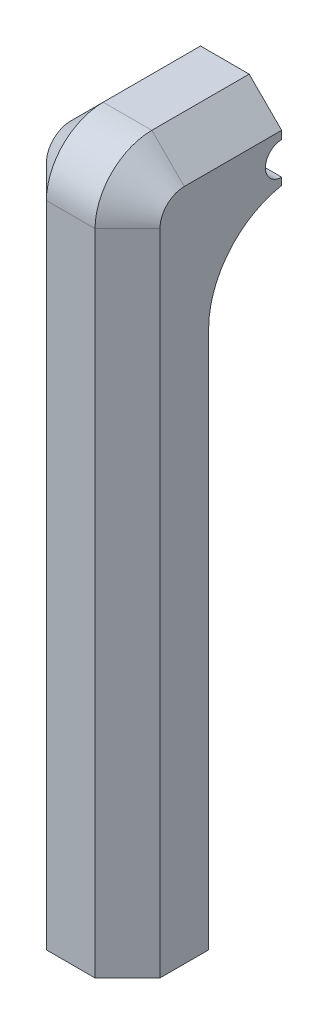
ISO-10303-21;
HEADER;
FILE_DESCRIPTION(('STEP AP214'),'2;1');
FILE_NAME('part.step','',(''),(''),'','','');
FILE_SCHEMA(('AUTOMOTIVE_DESIGN { 1 0 10303 214 1 1 1 1 }'));
ENDSEC;
DATA;
#1=APPLICATION_CONTEXT('core data for automotive mechanical design processes');
#2=APPLICATION_PROTOCOL_DEFINITION('international standard','automotive_design',2000,#1);
#3=PRODUCT_CONTEXT('',#1,'mechanical');
#4=PRODUCT('Part','Part','',(#3));
#5=PRODUCT_RELATED_PRODUCT_CATEGORY('part','',(#4));
#6=PRODUCT_DEFINITION_FORMATION('','',#4);
#7=PRODUCT_DEFINITION_CONTEXT('part definition',#1,'design');
#8=PRODUCT_DEFINITION('design','',#6,#7);
#9=PRODUCT_DEFINITION_SHAPE('','',#8);
#10=(LENGTH_UNIT() NAMED_UNIT(*) SI_UNIT(.MILLI.,.METRE.));
#11=(NAMED_UNIT(*) PLANE_ANGLE_UNIT() SI_UNIT($,.RADIAN.));
#12=(NAMED_UNIT(*) SI_UNIT($,.STERADIAN.) SOLID_ANGLE_UNIT());
#13=UNCERTAINTY_MEASURE_WITH_UNIT(LENGTH_MEASURE(1.E-05),#10,'distance_accuracy_value','');
#14=(GEOMETRIC_REPRESENTATION_CONTEXT(3) GLOBAL_UNCERTAINTY_ASSIGNED_CONTEXT((#13)) GLOBAL_UNIT_ASSIGNED_CONTEXT((#10,
#11,#12)) REPRESENTATION_CONTEXT('',''));
#15=CARTESIAN_POINT('',(0.,0.,0.));
#16=DIRECTION('',(0.,0.,1.));
#17=DIRECTION('',(1.,0.,0.));
#18=AXIS2_PLACEMENT_3D('',#15,#16,#17);
#19=CARTESIAN_POINT('',(35.,217.5,-30.));
#20=DIRECTION('',(0.,0.,1.));
#21=DIRECTION('',(0.,-1.,0.));
#22=AXIS2_PLACEMENT_3D('',#19,#20,#21);
#23=PLANE('',#22);
#24=DIRECTION('',(-1.,0.,0.));
#25=VECTOR('',#24,1.);
#26=CARTESIAN_POINT('',(35.,182.5,-30.));
#27=LINE('',#26,#25);
#28=CARTESIAN_POINT('',(24.9999999999999,182.5,-30.));
#29=VERTEX_POINT('',#28);
#30=CARTESIAN_POINT('',(10.,182.5,-30.));
#31=VERTEX_POINT('',#30);
#32=EDGE_CURVE('E191',#29,#31,#27,.T.);
#33=ORIENTED_EDGE('',*,*,#32,.T.);
#34=CARTESIAN_POINT('',(10.,182.5,-30.));
#35=CARTESIAN_POINT('',(9.58671287143342,182.931241905203,-30.));
#36=CARTESIAN_POINT('',(9.17277090749527,183.361855052991,-30.));
#37=CARTESIAN_POINT('',(8.34379001701739,184.222022584375,-30.));
#38=CARTESIAN_POINT('',(7.92875109278775,184.651576970199,-30.));
#39=CARTESIAN_POINT('',(7.09779112103367,185.509823542076,-30.));
#40=CARTESIAN_POINT('',(6.68187008176656,185.938515736128,-30.));
#41=CARTESIAN_POINT('',(5.84928979783932,186.795183027691,-30.));
#42=CARTESIAN_POINT('',(5.43263055273948,187.223158124774,-30.));
#43=CARTESIAN_POINT('',(4.18173849454783,188.506181376066,-30.));
#44=CARTESIAN_POINT('',(3.34658604527016,189.360332971445,-30.));
#45=CARTESIAN_POINT('',(2.09252930990413,190.640266168293,-30.));
#46=CARTESIAN_POINT('',(1.67428698915692,191.066696967164,-30.));
#47=CARTESIAN_POINT('',(0.837417826926725,191.919180533996,-30.));
#48=CARTESIAN_POINT('',(0.418790985705715,192.345233302214,-30.));
#49=CARTESIAN_POINT('',(0.,192.771124734731,-30.));
#50=B_SPLINE_CURVE_WITH_KNOTS('',3,(#34,#35,#36,#37,#38,#39,#40,#41,#42,#43,#44,#45,#46,#47,#48,
#49),.UNSPECIFIED.,.F.,.F.,(4,2,2,2,2,2,2,4),(0.,1.79191952214253,3.58383527368637,
5.37573432477595,7.16763444354607,10.7514117799922,12.543318117998,14.3352232360786),.UNSPECIFIED.);
#51=CARTESIAN_POINT('',(0.,192.771124734731,-30.));
#52=VERTEX_POINT('',#51);
#53=EDGE_CURVE('E11',#31,#52,#50,.T.);
#54=ORIENTED_EDGE('',*,*,#53,.T.);
#55=DIRECTION('',(0.,1.,0.));
#56=VECTOR('',#55,1.);
#57=CARTESIAN_POINT('',(0.,217.5,-30.));
#58=LINE('',#57,#56);
#59=CARTESIAN_POINT('',(0.,195.,-30.));
#60=VERTEX_POINT('',#59);
#61=EDGE_CURVE('E174',#52,#60,#58,.T.);
#62=ORIENTED_EDGE('',*,*,#61,.T.);
#63=DIRECTION('',(1.,0.,0.));
#64=VECTOR('',#63,1.);
#65=CARTESIAN_POINT('',(0.,195.,-30.));
#66=LINE('',#65,#64);
#67=CARTESIAN_POINT('',(35.,195.,-30.));
#68=VERTEX_POINT('',#67);
#69=EDGE_CURVE('E156',#60,#68,#66,.T.);
#70=ORIENTED_EDGE('',*,*,#69,.T.);
#71=DIRECTION('',(0.,1.,0.));
#72=VECTOR('',#71,1.);
#73=CARTESIAN_POINT('',(35.,217.5,-30.));
#74=LINE('',#73,#72);
#75=CARTESIAN_POINT('',(35.,192.771124734731,-30.));
#76=VERTEX_POINT('',#75);
#77=EDGE_CURVE('E318',#76,#68,#74,.T.);
#78=ORIENTED_EDGE('',*,*,#77,.F.);
#79=CARTESIAN_POINT('',(35.,192.771124734732,-30.));
#80=CARTESIAN_POINT('',(34.5812090142943,192.345233302214,-30.));
#81=CARTESIAN_POINT('',(34.1625821730733,191.919180533996,-30.));
#82=CARTESIAN_POINT('',(33.3257130108431,191.066696967164,-30.));
#83=CARTESIAN_POINT('',(32.9074706900959,190.640266168293,-30.));
#84=CARTESIAN_POINT('',(31.6534139547299,189.360332971445,-30.));
#85=CARTESIAN_POINT('',(30.8182615054522,188.506181376066,-30.));
#86=CARTESIAN_POINT('',(29.5673694472605,187.223158124774,-30.));
#87=CARTESIAN_POINT('',(29.1507102021607,186.795183027691,-30.));
#88=CARTESIAN_POINT('',(28.3181299182334,185.938515736128,-30.));
#89=CARTESIAN_POINT('',(27.9022088789663,185.509823542076,-30.));
#90=CARTESIAN_POINT('',(27.0712489072122,184.651576970199,-30.));
#91=CARTESIAN_POINT('',(26.6562099829826,184.222022584375,-30.));
#92=CARTESIAN_POINT('',(25.8272290925047,183.361855052991,-30.));
#93=CARTESIAN_POINT('',(25.4132871285666,182.931241905203,-30.));
#94=CARTESIAN_POINT('',(24.9999999999999,182.5,-30.));
#95=B_SPLINE_CURVE_WITH_KNOTS('',3,(#79,#80,#81,#82,#83,#84,#85,#86,#87,#88,#89,#90,#91,#92,#93,
#94),.UNSPECIFIED.,.F.,.F.,(4,2,2,2,2,2,2,4),(0.,1.79190511808055,3.58381145608641,
7.16758879253253,8.95948891130266,10.7513879623923,12.5433037139361,14.3352232360786),.UNSPECIFIED.);
#96=EDGE_CURVE('E256',#76,#29,#95,.T.);
#97=ORIENTED_EDGE('',*,*,#96,.T.);
#98=EDGE_LOOP('',(#33,#54,#62,#70,#78,#97));
#99=FACE_BOUND('',#98,.T.);
#100=ADVANCED_FACE('F33',(#99),#23,.F.);
#101=DIRECTION('',(-1.,0.,0.));
#102=VECTOR('',#101,1.);
#103=CARTESIAN_POINT('',(35.,217.5,-30.));
#104=LINE('',#103,#102);
#105=CARTESIAN_POINT('',(25.,217.5,-30.));
#106=VERTEX_POINT('',#105);
#107=CARTESIAN_POINT('',(10.,217.5,-30.));
#108=VERTEX_POINT('',#107);
#109=EDGE_CURVE('E189',#106,#108,#104,.T.);
#110=ORIENTED_EDGE('',*,*,#109,.F.);
#111=DIRECTION('',(0.707106781186548,-0.707106781186548,0.));
#112=VECTOR('',#111,1.);
#113=CARTESIAN_POINT('',(35.,207.5,-30.));
#114=LINE('',#113,#112);
#115=CARTESIAN_POINT('',(35.,207.5,-30.));
#116=VERTEX_POINT('',#115);
#117=EDGE_CURVE('E239',#106,#116,#114,.T.);
#118=ORIENTED_EDGE('',*,*,#117,.T.);
#119=CARTESIAN_POINT('',(35.,205.,-30.));
#120=VERTEX_POINT('',#119);
#121=EDGE_CURVE('E169',#120,#116,#74,.T.);
#122=ORIENTED_EDGE('',*,*,#121,.F.);
#123=DIRECTION('',(1.,0.,0.));
#124=VECTOR('',#123,1.);
#125=CARTESIAN_POINT('',(0.,205.,-30.));
#126=LINE('',#125,#124);
#127=CARTESIAN_POINT('',(0.,205.,-30.));
#128=VERTEX_POINT('',#127);
#129=EDGE_CURVE('E153',#120,#128,#126,.F.);
#130=ORIENTED_EDGE('',*,*,#129,.T.);
#131=CARTESIAN_POINT('',(0.,207.5,-30.));
#132=VERTEX_POINT('',#131);
#133=EDGE_CURVE('E166',#128,#132,#58,.T.);
#134=ORIENTED_EDGE('',*,*,#133,.T.);
#135=DIRECTION('',(-0.707106781186547,-0.707106781186549,0.));
#136=VECTOR('',#135,1.);
#137=CARTESIAN_POINT('',(10.,217.5,-30.));
#138=LINE('',#137,#136);
#139=EDGE_CURVE('E215',#132,#108,#138,.F.);
#140=ORIENTED_EDGE('',*,*,#139,.T.);
#141=EDGE_LOOP('',(#110,#118,#122,#130,#134,#140));
#142=FACE_BOUND('',#141,.T.);
#143=ADVANCED_FACE('F164',(#142),#23,.F.);
#144=CARTESIAN_POINT('',(35.,217.5,17.5));
#145=DIRECTION('',(0.,-1.,0.));
#146=DIRECTION('',(0.,0.,-1.));
#147=AXIS2_PLACEMENT_3D('',#144,#145,#146);
#148=PLANE('',#147);
#149=DIRECTION('',(-1.,0.,0.));
#150=VECTOR('',#149,1.);
#151=CARTESIAN_POINT('',(35.,217.5,0.));
#152=LINE('',#151,#150);
#153=CARTESIAN_POINT('',(10.,217.5,0.));
#154=VERTEX_POINT('',#153);
#155=CARTESIAN_POINT('',(25.,217.5,0.));
#156=VERTEX_POINT('',#155);
#157=EDGE_CURVE('E195',#154,#156,#152,.F.);
#158=ORIENTED_EDGE('',*,*,#157,.T.);
#159=DIRECTION('',(0.,0.,-1.));
#160=VECTOR('',#159,1.);
#161=CARTESIAN_POINT('',(25.,217.5,-30.));
#162=LINE('',#161,#160);
#163=EDGE_CURVE('E237',#156,#106,#162,.T.);
#164=ORIENTED_EDGE('',*,*,#163,.T.);
#165=ORIENTED_EDGE('',*,*,#109,.T.);
#166=DIRECTION('',(0.,0.,1.));
#167=VECTOR('',#166,1.);
#168=CARTESIAN_POINT('',(10.,217.5,17.5));
#169=LINE('',#168,#167);
#170=EDGE_CURVE('E213',#108,#154,#169,.T.);
#171=ORIENTED_EDGE('',*,*,#170,.T.);
#172=EDGE_LOOP('',(#158,#164,#165,#171));
#173=FACE_BOUND('',#172,.T.);
#174=ADVANCED_FACE('F272',(#173),#148,.F.);
#175=CARTESIAN_POINT('',(35.,0.,17.5));
#176=DIRECTION('',(0.,0.,-1.));
#177=DIRECTION('',(0.,1.,0.));
#178=AXIS2_PLACEMENT_3D('',#175,#176,#177);
#179=PLANE('',#178);
#180=DIRECTION('',(-1.,0.,0.));
#181=VECTOR('',#180,1.);
#182=CARTESIAN_POINT('',(35.,0.,17.5));
#183=LINE('',#182,#181);
#184=CARTESIAN_POINT('',(25.,0.,17.5));
#185=VERTEX_POINT('',#184);
#186=CARTESIAN_POINT('',(10.,0.,17.5));
#187=VERTEX_POINT('',#186);
#188=EDGE_CURVE('E187',#185,#187,#183,.T.);
#189=ORIENTED_EDGE('',*,*,#188,.F.);
#190=DIRECTION('',(0.,1.,0.));
#191=VECTOR('',#190,1.);
#192=CARTESIAN_POINT('',(25.,200.,17.5));
#193=LINE('',#192,#191);
#194=CARTESIAN_POINT('',(25.,200.,17.5));
#195=VERTEX_POINT('',#194);
#196=EDGE_CURVE('E233',#185,#195,#193,.T.);
#197=ORIENTED_EDGE('',*,*,#196,.T.);
#198=DIRECTION('',(-1.,0.,0.));
#199=VECTOR('',#198,1.);
#200=CARTESIAN_POINT('',(35.,200.,17.5));
#201=LINE('',#200,#199);
#202=CARTESIAN_POINT('',(10.,200.,17.5));
#203=VERTEX_POINT('',#202);
#204=EDGE_CURVE('E193',#195,#203,#201,.T.);
#205=ORIENTED_EDGE('',*,*,#204,.T.);
#206=DIRECTION('',(0.,-1.,0.));
#207=VECTOR('',#206,1.);
#208=CARTESIAN_POINT('',(10.,0.,17.5));
#209=LINE('',#208,#207);
#210=EDGE_CURVE('E200',#203,#187,#209,.T.);
#211=ORIENTED_EDGE('',*,*,#210,.T.);
#212=EDGE_LOOP('',(#189,#197,#205,#211));
#213=FACE_BOUND('',#212,.T.);
#214=ADVANCED_FACE('F337',(#213),#179,.F.);
#215=CARTESIAN_POINT('',(35.,0.,-17.5));
#216=DIRECTION('',(0.,1.,0.));
#217=DIRECTION('',(0.,0.,1.));
#218=AXIS2_PLACEMENT_3D('',#215,#216,#217);
#219=PLANE('',#218);
#220=DIRECTION('',(0.,0.,-1.));
#221=VECTOR('',#220,1.);
#222=CARTESIAN_POINT('',(0.,0.,-17.5));
#223=LINE('',#222,#221);
#224=CARTESIAN_POINT('',(0.,0.,7.49999999999997));
#225=VERTEX_POINT('',#224);
#226=CARTESIAN_POINT('',(0.,0.,-7.50000000000004));
#227=VERTEX_POINT('',#226);
#228=EDGE_CURVE('E176',#225,#227,#223,.T.);
#229=ORIENTED_EDGE('',*,*,#228,.T.);
#230=DIRECTION('',(-0.707106781186549,0.,0.707106781186546));
#231=VECTOR('',#230,1.);
#232=CARTESIAN_POINT('',(10.,0.,-17.5));
#233=LINE('',#232,#231);
#234=CARTESIAN_POINT('',(10.,0.,-17.5));
#235=VERTEX_POINT('',#234);
#236=EDGE_CURVE('E282',#227,#235,#233,.F.);
#237=ORIENTED_EDGE('',*,*,#236,.T.);
#238=DIRECTION('',(-1.,0.,0.));
#239=VECTOR('',#238,1.);
#240=CARTESIAN_POINT('',(35.,0.,-17.5));
#241=LINE('',#240,#239);
#242=CARTESIAN_POINT('',(24.9999999999999,0.,-17.5));
#243=VERTEX_POINT('',#242);
#244=EDGE_CURVE('E184',#243,#235,#241,.T.);
#245=ORIENTED_EDGE('',*,*,#244,.F.);
#246=DIRECTION('',(0.70710678118655,0.,0.707106781186545));
#247=VECTOR('',#246,1.);
#248=CARTESIAN_POINT('',(35.,0.,-7.50000000000003));
#249=LINE('',#248,#247);
#250=CARTESIAN_POINT('',(35.,0.,-7.50000000000003));
#251=VERTEX_POINT('',#250);
#252=EDGE_CURVE('E254',#243,#251,#249,.T.);
#253=ORIENTED_EDGE('',*,*,#252,.T.);
#254=DIRECTION('',(0.,0.,-1.));
#255=VECTOR('',#254,1.);
#256=CARTESIAN_POINT('',(35.,0.,-17.5));
#257=LINE('',#256,#255);
#258=CARTESIAN_POINT('',(35.,0.,7.49999999999999));
#259=VERTEX_POINT('',#258);
#260=EDGE_CURVE('E180',#259,#251,#257,.T.);
#261=ORIENTED_EDGE('',*,*,#260,.F.);
#262=DIRECTION('',(-0.707106781186548,0.,0.707106781186548));
#263=VECTOR('',#262,1.);
#264=CARTESIAN_POINT('',(35.,0.,7.5));
#265=LINE('',#264,#263);
#266=EDGE_CURVE('E231',#259,#185,#265,.T.);
#267=ORIENTED_EDGE('',*,*,#266,.T.);
#268=ORIENTED_EDGE('',*,*,#188,.T.);
#269=DIRECTION('',(0.707106781186547,0.,0.707106781186549));
#270=VECTOR('',#269,1.);
#271=CARTESIAN_POINT('',(10.,0.,17.5));
#272=LINE('',#271,#270);
#273=EDGE_CURVE('E203',#187,#225,#272,.F.);
#274=ORIENTED_EDGE('',*,*,#273,.T.);
#275=EDGE_LOOP('',(#229,#237,#245,#253,#261,#267,#268,#274));
#276=FACE_BOUND('',#275,.T.);
#277=ADVANCED_FACE('F333',(#276),#219,.F.);
#278=CARTESIAN_POINT('',(35.,182.5,-17.5));
#279=DIRECTION('',(0.,0.,1.));
#280=DIRECTION('',(0.,-1.,0.));
#281=AXIS2_PLACEMENT_3D('',#278,#279,#280);
#282=PLANE('',#281);
#283=ORIENTED_EDGE('',*,*,#244,.T.);
#284=DIRECTION('',(0.,1.,0.));
#285=VECTOR('',#284,1.);
#286=CARTESIAN_POINT('',(10.,182.5,-17.5));
#287=LINE('',#286,#285);
#288=CARTESIAN_POINT('',(10.,165.729490168752,-17.5));
#289=VERTEX_POINT('',#288);
#290=EDGE_CURVE('E287',#235,#289,#287,.T.);
#291=ORIENTED_EDGE('',*,*,#290,.T.);
#292=DIRECTION('',(1.,0.,0.));
#293=VECTOR('',#292,1.);
#294=CARTESIAN_POINT('',(35.,165.729490168752,-17.5));
#295=LINE('',#294,#293);
#296=CARTESIAN_POINT('',(24.9999999999999,165.729490168752,-17.5));
#297=VERTEX_POINT('',#296);
#298=EDGE_CURVE('E198',#289,#297,#295,.T.);
#299=ORIENTED_EDGE('',*,*,#298,.T.);
#300=DIRECTION('',(0.,-1.,0.));
#301=VECTOR('',#300,1.);
#302=CARTESIAN_POINT('',(24.9999999999999,0.,-17.5));
#303=LINE('',#302,#301);
#304=EDGE_CURVE('E252',#297,#243,#303,.T.);
#305=ORIENTED_EDGE('',*,*,#304,.T.);
#306=EDGE_LOOP('',(#283,#291,#299,#305));
#307=FACE_BOUND('',#306,.T.);
#308=ADVANCED_FACE('F302',(#307),#282,.F.);
#309=CARTESIAN_POINT('',(35.,0.,0.));
#310=DIRECTION('',(1.,0.,0.));
#311=DIRECTION('',(0.,0.,-1.));
#312=AXIS2_PLACEMENT_3D('',#309,#310,#311);
#313=PLANE('',#312);
#314=ORIENTED_EDGE('',*,*,#260,.T.);
#315=DIRECTION('',(0.,1.,0.));
#316=VECTOR('',#315,1.);
#317=CARTESIAN_POINT('',(35.,165.729490168752,-7.50000000000001));
#318=LINE('',#317,#316);
#319=CARTESIAN_POINT('',(35.,165.729490168752,-7.5));
#320=VERTEX_POINT('',#319);
#321=EDGE_CURVE('E249',#251,#320,#318,.T.);
#322=ORIENTED_EDGE('',*,*,#321,.T.);
#323=CARTESIAN_POINT('',(35.,165.729490168752,-35.));
#324=DIRECTION('',(1.,0.,0.));
#325=DIRECTION('',(0.,0.,-1.));
#326=AXIS2_PLACEMENT_3D('',#323,#324,#325);
#327=CIRCLE('',#326,27.5);
#328=EDGE_CURVE('E241',#320,#76,#327,.F.);
#329=ORIENTED_EDGE('',*,*,#328,.T.);
#330=ORIENTED_EDGE('',*,*,#77,.T.);
#331=CARTESIAN_POINT('',(35.,200.,-30.));
#332=DIRECTION('',(1.,0.,0.));
#333=DIRECTION('',(0.,0.,-1.));
#334=AXIS2_PLACEMENT_3D('',#331,#332,#333);
#335=CIRCLE('',#334,5.);
#336=EDGE_CURVE('E158',#120,#68,#335,.T.);
#337=ORIENTED_EDGE('',*,*,#336,.F.);
#338=ORIENTED_EDGE('',*,*,#121,.T.);
#339=DIRECTION('',(0.,0.,1.));
#340=VECTOR('',#339,1.);
#341=CARTESIAN_POINT('',(35.,207.5,0.));
#342=LINE('',#341,#340);
#343=CARTESIAN_POINT('',(35.,207.5,0.));
#344=VERTEX_POINT('',#343);
#345=EDGE_CURVE('E217',#116,#344,#342,.T.);
#346=ORIENTED_EDGE('',*,*,#345,.T.);
#347=CARTESIAN_POINT('',(35.,200.,0.));
#348=DIRECTION('',(1.,0.,0.));
#349=DIRECTION('',(0.,0.,-1.));
#350=AXIS2_PLACEMENT_3D('',#347,#348,#349);
#351=CIRCLE('',#350,7.50000000000001);
#352=CARTESIAN_POINT('',(35.,200.,7.50000000000001));
#353=VERTEX_POINT('',#352);
#354=EDGE_CURVE('E226',#344,#353,#351,.T.);
#355=ORIENTED_EDGE('',*,*,#354,.T.);
#356=DIRECTION('',(0.,-1.,0.));
#357=VECTOR('',#356,1.);
#358=CARTESIAN_POINT('',(35.,0.,7.5));
#359=LINE('',#358,#357);
#360=EDGE_CURVE('E228',#353,#259,#359,.T.);
#361=ORIENTED_EDGE('',*,*,#360,.T.);
#362=EDGE_LOOP('',(#314,#322,#329,#330,#337,#338,#346,#355,#361));
#363=FACE_BOUND('',#362,.T.);
#364=ADVANCED_FACE('F314',(#363),#313,.T.);
#365=CARTESIAN_POINT('',(0.,0.,0.));
#366=DIRECTION('',(1.,0.,0.));
#367=DIRECTION('',(0.,0.,-1.));
#368=AXIS2_PLACEMENT_3D('',#365,#366,#367);
#369=PLANE('',#368);
#370=CARTESIAN_POINT('',(0.,165.729490168752,-35.));
#371=DIRECTION('',(1.,0.,0.));
#372=DIRECTION('',(0.,0.,-1.));
#373=AXIS2_PLACEMENT_3D('',#370,#371,#372);
#374=CIRCLE('',#373,27.5);
#375=CARTESIAN_POINT('',(0.,165.729490168752,-7.50000000000001));
#376=VERTEX_POINT('',#375);
#377=EDGE_CURVE('E57',#52,#376,#374,.T.);
#378=ORIENTED_EDGE('',*,*,#377,.T.);
#379=DIRECTION('',(0.,-1.,0.));
#380=VECTOR('',#379,1.);
#381=CARTESIAN_POINT('',(0.,0.,-7.50000000000004));
#382=LINE('',#381,#380);
#383=EDGE_CURVE('E284',#376,#227,#382,.T.);
#384=ORIENTED_EDGE('',*,*,#383,.T.);
#385=ORIENTED_EDGE('',*,*,#228,.F.);
#386=DIRECTION('',(0.,1.,0.));
#387=VECTOR('',#386,1.);
#388=CARTESIAN_POINT('',(0.,0.,7.49999999999997));
#389=LINE('',#388,#387);
#390=CARTESIAN_POINT('',(0.,200.,7.49999999999998));
#391=VERTEX_POINT('',#390);
#392=EDGE_CURVE('E208',#225,#391,#389,.T.);
#393=ORIENTED_EDGE('',*,*,#392,.T.);
#394=CARTESIAN_POINT('',(0.,200.,0.));
#395=DIRECTION('',(1.,0.,0.));
#396=DIRECTION('',(0.,0.,-1.));
#397=AXIS2_PLACEMENT_3D('',#394,#395,#396);
#398=CIRCLE('',#397,7.49999999999998);
#399=CARTESIAN_POINT('',(0.,207.5,0.));
#400=VERTEX_POINT('',#399);
#401=EDGE_CURVE('E206',#391,#400,#398,.F.);
#402=ORIENTED_EDGE('',*,*,#401,.T.);
#403=DIRECTION('',(0.,0.,-1.));
#404=VECTOR('',#403,1.);
#405=CARTESIAN_POINT('',(0.,207.5,0.));
#406=LINE('',#405,#404);
#407=EDGE_CURVE('E173',#400,#132,#406,.T.);
#408=ORIENTED_EDGE('',*,*,#407,.T.);
#409=ORIENTED_EDGE('',*,*,#133,.F.);
#410=CARTESIAN_POINT('',(0.,200.,-30.));
#411=DIRECTION('',(1.,0.,0.));
#412=DIRECTION('',(0.,0.,-1.));
#413=AXIS2_PLACEMENT_3D('',#410,#411,#412);
#414=CIRCLE('',#413,5.);
#415=EDGE_CURVE('E149',#128,#60,#414,.T.);
#416=ORIENTED_EDGE('',*,*,#415,.T.);
#417=ORIENTED_EDGE('',*,*,#61,.F.);
#418=EDGE_LOOP('',(#378,#384,#385,#393,#402,#408,#409,#416,#417));
#419=FACE_BOUND('',#418,.T.);
#420=ADVANCED_FACE('F171',(#419),#369,.F.);
#421=CARTESIAN_POINT('',(35.,200.,0.));
#422=DIRECTION('',(-1.,0.,0.));
#423=DIRECTION('',(0.,0.,1.));
#424=AXIS2_PLACEMENT_3D('',#421,#422,#423);
#425=CYLINDRICAL_SURFACE('',#424,17.5);
#426=ORIENTED_EDGE('',*,*,#204,.F.);
#427=CARTESIAN_POINT('',(25.,200.,0.));
#428=DIRECTION('',(1.,0.,0.));
#429=DIRECTION('',(0.,0.,-1.));
#430=AXIS2_PLACEMENT_3D('',#427,#428,#429);
#431=CIRCLE('',#430,17.5);
#432=EDGE_CURVE('E235',#195,#156,#431,.F.);
#433=ORIENTED_EDGE('',*,*,#432,.T.);
#434=ORIENTED_EDGE('',*,*,#157,.F.);
#435=CARTESIAN_POINT('',(10.,200.,0.));
#436=DIRECTION('',(1.,0.,0.));
#437=DIRECTION('',(0.,0.,-1.));
#438=AXIS2_PLACEMENT_3D('',#435,#436,#437);
#439=CIRCLE('',#438,17.5);
#440=EDGE_CURVE('E210',#154,#203,#439,.T.);
#441=ORIENTED_EDGE('',*,*,#440,.T.);
#442=EDGE_LOOP('',(#426,#433,#434,#441));
#443=FACE_BOUND('',#442,.T.);
#444=ADVANCED_FACE('F274',(#443),#425,.T.);
#445=CARTESIAN_POINT('',(35.,165.729490168752,-35.));
#446=DIRECTION('',(1.,0.,0.));
#447=DIRECTION('',(0.,0.,-1.));
#448=AXIS2_PLACEMENT_3D('',#445,#446,#447);
#449=CYLINDRICAL_SURFACE('',#448,17.5);
#450=ORIENTED_EDGE('',*,*,#298,.F.);
#451=CARTESIAN_POINT('',(10.,165.729490168752,-35.));
#452=DIRECTION('',(1.,0.,0.));
#453=DIRECTION('',(0.,0.,-1.));
#454=AXIS2_PLACEMENT_3D('',#451,#452,#453);
#455=CIRCLE('',#454,17.5);
#456=EDGE_CURVE('E43',#289,#31,#455,.F.);
#457=ORIENTED_EDGE('',*,*,#456,.T.);
#458=ORIENTED_EDGE('',*,*,#32,.F.);
#459=CARTESIAN_POINT('',(24.9999999999999,165.729490168752,-35.));
#460=DIRECTION('',(1.,0.,0.));
#461=DIRECTION('',(0.,0.,-1.));
#462=AXIS2_PLACEMENT_3D('',#459,#460,#461);
#463=CIRCLE('',#462,17.5);
#464=EDGE_CURVE('E263',#29,#297,#463,.T.);
#465=ORIENTED_EDGE('',*,*,#464,.T.);
#466=EDGE_LOOP('',(#450,#457,#458,#465));
#467=FACE_BOUND('',#466,.T.);
#468=ADVANCED_FACE('F305',(#467),#449,.F.);
#469=CARTESIAN_POINT('',(0.,200.,-30.));
#470=DIRECTION('',(1.,0.,0.));
#471=DIRECTION('',(0.,0.,-1.));
#472=AXIS2_PLACEMENT_3D('',#469,#470,#471);
#473=CYLINDRICAL_SURFACE('',#472,5.);
#474=ORIENTED_EDGE('',*,*,#415,.F.);
#475=ORIENTED_EDGE('',*,*,#129,.F.);
#476=ORIENTED_EDGE('',*,*,#336,.T.);
#477=ORIENTED_EDGE('',*,*,#69,.F.);
#478=EDGE_LOOP('',(#474,#475,#476,#477));
#479=FACE_BOUND('',#478,.T.);
#480=ADVANCED_FACE('F151',(#479),#473,.F.);
#481=CARTESIAN_POINT('',(10.,217.5,17.5));
#482=DIRECTION('',(0.707106781186549,-0.707106781186547,0.));
#483=DIRECTION('',(0.,0.,1.));
#484=AXIS2_PLACEMENT_3D('',#481,#482,#483);
#485=PLANE('',#484);
#486=ORIENTED_EDGE('',*,*,#139,.F.);
#487=ORIENTED_EDGE('',*,*,#407,.F.);
#488=DIRECTION('',(-0.707106781186547,-0.707106781186549,0.));
#489=VECTOR('',#488,1.);
#490=CARTESIAN_POINT('',(10.,217.5,0.));
#491=LINE('',#490,#489);
#492=EDGE_CURVE('E221',#154,#400,#491,.T.);
#493=ORIENTED_EDGE('',*,*,#492,.F.);
#494=ORIENTED_EDGE('',*,*,#170,.F.);
#495=EDGE_LOOP('',(#486,#487,#493,#494));
#496=FACE_BOUND('',#495,.T.);
#497=ADVANCED_FACE('F419',(#496),#485,.F.);
#498=CARTESIAN_POINT('',(0.,200.,0.));
#499=DIRECTION('',(1.,0.,0.));
#500=DIRECTION('',(0.,0.,-1.));
#501=AXIS2_PLACEMENT_3D('',#498,#499,#500);
#502=CONICAL_SURFACE('',#501,7.49999999999998,0.785398163397449);
#503=ORIENTED_EDGE('',*,*,#492,.T.);
#504=ORIENTED_EDGE('',*,*,#401,.F.);
#505=DIRECTION('',(-0.707106781186547,0.,-0.707106781186548));
#506=VECTOR('',#505,1.);
#507=CARTESIAN_POINT('',(10.,200.,17.5));
#508=LINE('',#507,#506);
#509=EDGE_CURVE('E218',#203,#391,#508,.T.);
#510=ORIENTED_EDGE('',*,*,#509,.F.);
#511=ORIENTED_EDGE('',*,*,#440,.F.);
#512=EDGE_LOOP('',(#503,#504,#510,#511));
#513=FACE_BOUND('',#512,.T.);
#514=ADVANCED_FACE('F411',(#513),#502,.T.);
#515=CARTESIAN_POINT('',(10.,0.,17.5));
#516=DIRECTION('',(0.707106781186549,0.,-0.707106781186547));
#517=DIRECTION('',(0.,-1.,0.));
#518=AXIS2_PLACEMENT_3D('',#515,#516,#517);
#519=PLANE('',#518);
#520=ORIENTED_EDGE('',*,*,#509,.T.);
#521=ORIENTED_EDGE('',*,*,#392,.F.);
#522=ORIENTED_EDGE('',*,*,#273,.F.);
#523=ORIENTED_EDGE('',*,*,#210,.F.);
#524=EDGE_LOOP('',(#520,#521,#522,#523));
#525=FACE_BOUND('',#524,.T.);
#526=ADVANCED_FACE('F402',(#525),#519,.F.);
#527=CARTESIAN_POINT('',(35.,207.5,0.));
#528=DIRECTION('',(0.707106781186547,0.707106781186547,0.));
#529=DIRECTION('',(0.,0.,-1.));
#530=AXIS2_PLACEMENT_3D('',#527,#528,#529);
#531=PLANE('',#530);
#532=ORIENTED_EDGE('',*,*,#117,.F.);
#533=ORIENTED_EDGE('',*,*,#163,.F.);
#534=DIRECTION('',(-0.707106781186547,0.707106781186547,0.));
#535=VECTOR('',#534,1.);
#536=CARTESIAN_POINT('',(35.,207.5,0.));
#537=LINE('',#536,#535);
#538=EDGE_CURVE('E222',#344,#156,#537,.T.);
#539=ORIENTED_EDGE('',*,*,#538,.F.);
#540=ORIENTED_EDGE('',*,*,#345,.F.);
#541=EDGE_LOOP('',(#532,#533,#539,#540));
#542=FACE_BOUND('',#541,.T.);
#543=ADVANCED_FACE('F394',(#542),#531,.T.);
#544=CARTESIAN_POINT('',(35.,200.,0.));
#545=DIRECTION('',(-1.,0.,0.));
#546=DIRECTION('',(0.,0.,1.));
#547=AXIS2_PLACEMENT_3D('',#544,#545,#546);
#548=CONICAL_SURFACE('',#547,7.50000000000001,0.785398163397448);
#549=ORIENTED_EDGE('',*,*,#538,.T.);
#550=ORIENTED_EDGE('',*,*,#432,.F.);
#551=DIRECTION('',(-0.707106781186548,0.,0.707106781186547));
#552=VECTOR('',#551,1.);
#553=CARTESIAN_POINT('',(35.,200.,7.50000000000001));
#554=LINE('',#553,#552);
#555=EDGE_CURVE('E242',#353,#195,#554,.T.);
#556=ORIENTED_EDGE('',*,*,#555,.F.);
#557=ORIENTED_EDGE('',*,*,#354,.F.);
#558=EDGE_LOOP('',(#549,#550,#556,#557));
#559=FACE_BOUND('',#558,.T.);
#560=ADVANCED_FACE('F386',(#559),#548,.T.);
#561=CARTESIAN_POINT('',(35.,0.,7.5));
#562=DIRECTION('',(0.707106781186547,0.,0.707106781186547));
#563=DIRECTION('',(0.,1.,0.));
#564=AXIS2_PLACEMENT_3D('',#561,#562,#563);
#565=PLANE('',#564);
#566=ORIENTED_EDGE('',*,*,#555,.T.);
#567=ORIENTED_EDGE('',*,*,#196,.F.);
#568=ORIENTED_EDGE('',*,*,#266,.F.);
#569=ORIENTED_EDGE('',*,*,#360,.F.);
#570=EDGE_LOOP('',(#566,#567,#568,#569));
#571=FACE_BOUND('',#570,.T.);
#572=ADVANCED_FACE('F379',(#571),#565,.T.);
#573=CARTESIAN_POINT('',(35.,165.729490168752,-35.));
#574=DIRECTION('',(1.,0.,0.));
#575=DIRECTION('',(0.,0.,-1.));
#576=AXIS2_PLACEMENT_3D('',#573,#574,#575);
#577=CONICAL_SURFACE('',#576,27.5,0.785398163397445);
#578=ORIENTED_EDGE('',*,*,#96,.F.);
#579=ORIENTED_EDGE('',*,*,#328,.F.);
#580=DIRECTION('',(0.70710678118655,0.,0.707106781186546));
#581=VECTOR('',#580,1.);
#582=CARTESIAN_POINT('',(24.9999999999999,165.729490168752,-17.5));
#583=LINE('',#582,#581);
#584=EDGE_CURVE('E245',#297,#320,#583,.T.);
#585=ORIENTED_EDGE('',*,*,#584,.F.);
#586=ORIENTED_EDGE('',*,*,#464,.F.);
#587=EDGE_LOOP('',(#578,#579,#585,#586));
#588=FACE_BOUND('',#587,.T.);
#589=ADVANCED_FACE('F265',(#588),#577,.F.);
#590=CARTESIAN_POINT('',(35.,0.,-7.50000000000003));
#591=DIRECTION('',(0.707106781186545,0.,-0.70710678118655));
#592=DIRECTION('',(0.,-1.,0.));
#593=AXIS2_PLACEMENT_3D('',#590,#591,#592);
#594=PLANE('',#593);
#595=ORIENTED_EDGE('',*,*,#252,.F.);
#596=ORIENTED_EDGE('',*,*,#304,.F.);
#597=ORIENTED_EDGE('',*,*,#584,.T.);
#598=ORIENTED_EDGE('',*,*,#321,.F.);
#599=EDGE_LOOP('',(#595,#596,#597,#598));
#600=FACE_BOUND('',#599,.T.);
#601=ADVANCED_FACE('F310',(#600),#594,.T.);
#602=CARTESIAN_POINT('',(0.,165.729490168752,-35.));
#603=DIRECTION('',(-1.,0.,0.));
#604=DIRECTION('',(0.,0.,1.));
#605=AXIS2_PLACEMENT_3D('',#602,#603,#604);
#606=CONICAL_SURFACE('',#605,27.5,0.785398163397446);
#607=ORIENTED_EDGE('',*,*,#53,.F.);
#608=ORIENTED_EDGE('',*,*,#456,.F.);
#609=DIRECTION('',(0.707106781186549,0.,-0.707106781186546));
#610=VECTOR('',#609,1.);
#611=CARTESIAN_POINT('',(0.,165.729490168752,-7.50000000000001));
#612=LINE('',#611,#610);
#613=EDGE_CURVE('E38',#376,#289,#612,.T.);
#614=ORIENTED_EDGE('',*,*,#613,.F.);
#615=ORIENTED_EDGE('',*,*,#377,.F.);
#616=EDGE_LOOP('',(#607,#608,#614,#615));
#617=FACE_BOUND('',#616,.T.);
#618=ADVANCED_FACE('F35',(#617),#606,.F.);
#619=CARTESIAN_POINT('',(10.,182.5,-17.5));
#620=DIRECTION('',(0.707106781186546,0.,0.707106781186549));
#621=DIRECTION('',(0.,1.,0.));
#622=AXIS2_PLACEMENT_3D('',#619,#620,#621);
#623=PLANE('',#622);
#624=ORIENTED_EDGE('',*,*,#236,.F.);
#625=ORIENTED_EDGE('',*,*,#383,.F.);
#626=ORIENTED_EDGE('',*,*,#613,.T.);
#627=ORIENTED_EDGE('',*,*,#290,.F.);
#628=EDGE_LOOP('',(#624,#625,#626,#627));
#629=FACE_BOUND('',#628,.T.);
#630=ADVANCED_FACE('F298',(#629),#623,.F.);
#631=CLOSED_SHELL('',(#100,#143,#174,#214,#277,#308,#364,#420,#444,#468,#480,#497,#514,#526,
#543,#560,#572,#589,#601,#618,#630));
#632=MANIFOLD_SOLID_BREP('B2',#631);
#633=ADVANCED_BREP_SHAPE_REPRESENTATION('',(#18,#632),#14);
#634=SHAPE_DEFINITION_REPRESENTATION(#9,#633);
ENDSEC;
END-ISO-10303-21;
